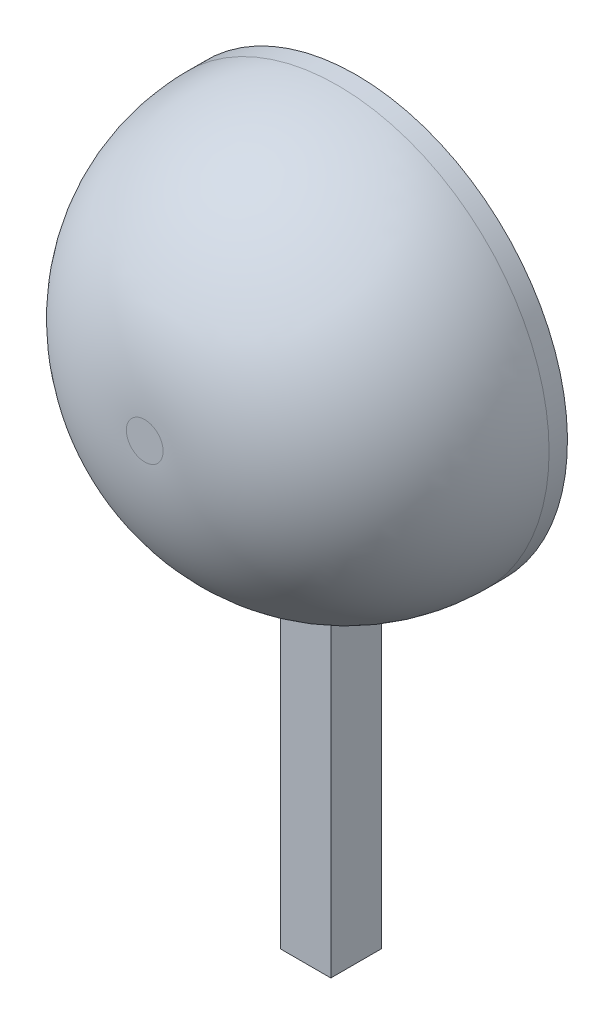
ISO-10303-21;
HEADER;
FILE_DESCRIPTION(('STEP AP214'),'2;1');
FILE_NAME('part.step','',(''),(''),'','','');
FILE_SCHEMA(('AUTOMOTIVE_DESIGN { 1 0 10303 214 1 1 1 1 }'));
ENDSEC;
DATA;
#1=APPLICATION_CONTEXT('core data for automotive mechanical design processes');
#2=APPLICATION_PROTOCOL_DEFINITION('international standard','automotive_design',2000,#1);
#3=PRODUCT_CONTEXT('',#1,'mechanical');
#4=PRODUCT('Part','Part','',(#3));
#5=PRODUCT_RELATED_PRODUCT_CATEGORY('part','',(#4));
#6=PRODUCT_DEFINITION_FORMATION('','',#4);
#7=PRODUCT_DEFINITION_CONTEXT('part definition',#1,'design');
#8=PRODUCT_DEFINITION('design','',#6,#7);
#9=PRODUCT_DEFINITION_SHAPE('','',#8);
#10=(LENGTH_UNIT() NAMED_UNIT(*) SI_UNIT(.MILLI.,.METRE.));
#11=(NAMED_UNIT(*) PLANE_ANGLE_UNIT() SI_UNIT($,.RADIAN.));
#12=(NAMED_UNIT(*) SI_UNIT($,.STERADIAN.) SOLID_ANGLE_UNIT());
#13=UNCERTAINTY_MEASURE_WITH_UNIT(LENGTH_MEASURE(1.E-05),#10,'distance_accuracy_value','');
#14=(GEOMETRIC_REPRESENTATION_CONTEXT(3) GLOBAL_UNCERTAINTY_ASSIGNED_CONTEXT((#13)) GLOBAL_UNIT_ASSIGNED_CONTEXT((#10,
#11,#12)) REPRESENTATION_CONTEXT('',''));
#15=CARTESIAN_POINT('',(0.,0.,0.));
#16=DIRECTION('',(0.,0.,1.));
#17=DIRECTION('',(1.,0.,0.));
#18=AXIS2_PLACEMENT_3D('',#15,#16,#17);
#19=CARTESIAN_POINT('',(0.,23.,23.));
#20=DIRECTION('',(0.,0.,-1.));
#21=DIRECTION('',(-1.,0.,0.));
#22=AXIS2_PLACEMENT_3D('',#19,#20,#21);
#23=CYLINDRICAL_SURFACE('',#22,23.);
#24=DIRECTION('',(0.,0.,-1.));
#25=VECTOR('',#24,1.);
#26=CARTESIAN_POINT('',(-2.75,0.164993978542503,23.));
#27=LINE('',#26,#25);
#28=CARTESIAN_POINT('',(-2.75,0.164993978542503,2.));
#29=VERTEX_POINT('',#28);
#30=CARTESIAN_POINT('',(-2.75,0.164993978542503,0.));
#31=VERTEX_POINT('',#30);
#32=EDGE_CURVE('E113',#29,#31,#27,.T.);
#33=ORIENTED_EDGE('',*,*,#32,.F.);
#34=CARTESIAN_POINT('',(0.,23.,2.));
#35=DIRECTION('',(0.,0.,1.));
#36=DIRECTION('',(1.,0.,0.));
#37=AXIS2_PLACEMENT_3D('',#34,#35,#36);
#38=CIRCLE('',#37,23.);
#39=CARTESIAN_POINT('',(2.75,0.164993978542503,2.));
#40=VERTEX_POINT('',#39);
#41=EDGE_CURVE('E127',#29,#40,#38,.F.);
#42=ORIENTED_EDGE('',*,*,#41,.T.);
#43=DIRECTION('',(0.,0.,-1.));
#44=VECTOR('',#43,1.);
#45=CARTESIAN_POINT('',(2.75,0.164993978542503,23.));
#46=LINE('',#45,#44);
#47=CARTESIAN_POINT('',(2.75,0.164993978542503,0.));
#48=VERTEX_POINT('',#47);
#49=EDGE_CURVE('E51',#48,#40,#46,.F.);
#50=ORIENTED_EDGE('',*,*,#49,.F.);
#51=CARTESIAN_POINT('',(0.,23.,0.));
#52=DIRECTION('',(0.,0.,1.));
#53=DIRECTION('',(1.,0.,0.));
#54=AXIS2_PLACEMENT_3D('',#51,#52,#53);
#55=CIRCLE('',#54,23.);
#56=EDGE_CURVE('E119',#48,#31,#55,.T.);
#57=ORIENTED_EDGE('',*,*,#56,.T.);
#58=EDGE_LOOP('',(#33,#42,#50,#57));
#59=FACE_BOUND('',#58,.T.);
#60=ADVANCED_FACE('F33',(#59),#23,.T.);
#61=CARTESIAN_POINT('',(0.,23.,2.));
#62=DIRECTION('',(0.,0.,1.));
#63=DIRECTION('',(1.,0.,0.));
#64=AXIS2_PLACEMENT_3D('',#61,#62,#63);
#65=DEGENERATE_TOROIDAL_SURFACE('',#64,2.,21.,.T.);
#66=CARTESIAN_POINT('',(0.,23.,23.));
#67=DIRECTION('',(0.,0.,1.));
#68=DIRECTION('',(1.,0.,0.));
#69=AXIS2_PLACEMENT_3D('',#66,#67,#68);
#70=CIRCLE('',#69,2.);
#71=CARTESIAN_POINT('',(2.,23.,23.));
#72=VERTEX_POINT('',#71);
#73=EDGE_CURVE('E124',#72,#72,#70,.T.);
#74=ORIENTED_EDGE('',*,*,#73,.F.);
#75=EDGE_LOOP('',(#74));
#76=FACE_BOUND('',#75,.T.);
#77=ORIENTED_EDGE('',*,*,#41,.F.);
#78=CARTESIAN_POINT('',(-2.75,0.244238915461579,3.81607804104343));
#79=CARTESIAN_POINT('',(-2.75,0.295303904716907,4.40007617175315));
#80=CARTESIAN_POINT('',(-2.75,0.371016300284282,4.98196435726745));
#81=CARTESIAN_POINT('',(-2.75,0.57120521786601,6.13732897865769));
#82=CARTESIAN_POINT('',(-2.75,0.695686814020979,6.71080453280703));
#83=CARTESIAN_POINT('',(-2.75,0.992555193617561,7.84534926697437));
#84=CARTESIAN_POINT('',(-2.75,1.16495162679832,8.40641592332233));
#85=CARTESIAN_POINT('',(-2.75,1.5564023105713,9.51201076491817));
#86=CARTESIAN_POINT('',(-2.75,1.77545530625545,10.0565393945346));
#87=CARTESIAN_POINT('',(-2.75,2.2585327522747,11.1249316469739));
#88=CARTESIAN_POINT('',(-2.75,2.52253402154036,11.6488057512484));
#89=CARTESIAN_POINT('',(-2.75,3.09370393761903,12.6724724277192));
#90=CARTESIAN_POINT('',(-2.75,3.40087290034709,13.1722648236419));
#91=CARTESIAN_POINT('',(-2.75,4.05643175349115,14.1445907349835));
#92=CARTESIAN_POINT('',(-2.75,4.40485254613023,14.6171034156274));
#93=CARTESIAN_POINT('',(-2.75,5.14023703734471,15.5311141664409));
#94=CARTESIAN_POINT('',(-2.75,5.5272005821954,15.9726123602974));
#95=CARTESIAN_POINT('',(-2.75,6.33742567468135,16.822026863039));
#96=CARTESIAN_POINT('',(-2.75,6.76073323458084,17.2298992820323));
#97=CARTESIAN_POINT('',(-2.75,7.64018950685398,18.0085640189915));
#98=CARTESIAN_POINT('',(-2.75,8.09633871399933,18.3793557781223));
#99=CARTESIAN_POINT('',(-2.75,9.03716404408144,19.0804956837766));
#100=CARTESIAN_POINT('',(-2.75,9.52177535815026,19.4109308106159));
#101=CARTESIAN_POINT('',(-2.75,10.5169438277042,20.0300310442123));
#102=CARTESIAN_POINT('',(-2.75,11.0274994033913,20.3186986901666));
#103=CARTESIAN_POINT('',(-2.75,12.0719691863424,20.8529243933765));
#104=CARTESIAN_POINT('',(-2.75,12.6059286872855,21.0983937910228));
#105=CARTESIAN_POINT('',(-2.75,13.6926077232238,21.5440764004659));
#106=CARTESIAN_POINT('',(-2.75,14.2453310192739,21.7442804768447));
#107=CARTESIAN_POINT('',(-2.75,15.0862669164747,22.010175908242));
#108=CARTESIAN_POINT('',(-2.75,15.3691164663192,22.0932005118105));
#109=CARTESIAN_POINT('',(-2.75,15.9380057408056,22.2475698902053));
#110=CARTESIAN_POINT('',(-2.75,16.2240454834208,22.3189145991925));
#111=CARTESIAN_POINT('',(-2.75,16.7985606702938,22.4498904912019));
#112=CARTESIAN_POINT('',(-2.75,17.0870341386364,22.5095303715771));
#113=CARTESIAN_POINT('',(-2.75,17.666125943743,22.6172944393123));
#114=CARTESIAN_POINT('',(-2.75,17.9567442786328,22.6654186367331));
#115=CARTESIAN_POINT('',(-2.75,18.4537104493097,22.7379162666053));
#116=CARTESIAN_POINT('',(-2.75,18.6596528964629,22.7651095412165));
#117=CARTESIAN_POINT('',(-2.75,19.0721786847007,22.8140979581512));
#118=CARTESIAN_POINT('',(-2.75,19.278762023405,22.8358931205008));
#119=CARTESIAN_POINT('',(-2.75,19.6924227432184,22.8743590640604));
#120=CARTESIAN_POINT('',(-2.75,19.8995001722479,22.891029326017));
#121=CARTESIAN_POINT('',(-2.75,20.3139740508323,22.9196501842365));
#122=CARTESIAN_POINT('',(-2.75,20.5213704953283,22.9316008545799));
#123=CARTESIAN_POINT('',(-2.75,20.9367876431798,22.9513898355892));
#124=CARTESIAN_POINT('',(-2.75,21.1448087471924,22.9592195317653));
#125=CARTESIAN_POINT('',(-2.75,21.5609483326243,22.9715169215669));
#126=CARTESIAN_POINT('',(-2.75,21.7690668152872,22.9759845710103));
#127=CARTESIAN_POINT('',(-2.75,22.1853625697365,22.9824505563655));
#128=CARTESIAN_POINT('',(-2.75,22.393539845524,22.9844486098226));
#129=CARTESIAN_POINT('',(-2.75,22.8099027138048,22.9866671576507));
#130=CARTESIAN_POINT('',(-2.75,23.0180883063022,22.9868876511322));
#131=CARTESIAN_POINT('',(-2.75,23.4343587271784,22.9856500310992));
#132=CARTESIAN_POINT('',(-2.75,23.6424435575414,22.9841926954817));
#133=CARTESIAN_POINT('',(-2.75,24.058587284974,22.9790389668758));
#134=CARTESIAN_POINT('',(-2.75,24.26664618216,22.9753425843263));
#135=CARTESIAN_POINT('',(-2.75,24.6826569741152,22.964835366272));
#136=CARTESIAN_POINT('',(-2.75,24.8906088806108,22.9580250239953));
#137=CARTESIAN_POINT('',(-2.75,25.306348294326,22.9404577753084));
#138=CARTESIAN_POINT('',(-2.75,25.5141358030221,22.9297009047572));
#139=CARTESIAN_POINT('',(-2.75,25.9289637460727,22.9036234131667));
#140=CARTESIAN_POINT('',(-2.75,26.1360048119144,22.8883130528973));
#141=CARTESIAN_POINT('',(-2.75,26.5496547141204,22.8526738434037));
#142=CARTESIAN_POINT('',(-2.75,26.7562635407797,22.8323448826917));
#143=CARTESIAN_POINT('',(-2.75,27.375200315473,22.763343181103));
#144=CARTESIAN_POINT('',(-2.75,27.7866811081787,22.706653095957));
#145=CARTESIAN_POINT('',(-2.75,28.491562162917,22.5895721272552));
#146=CARTESIAN_POINT('',(-2.75,28.7858804994783,22.5346254124817));
#147=CARTESIAN_POINT('',(-2.75,29.3720241318357,22.4127560316632));
#148=CARTESIAN_POINT('',(-2.75,29.66384954233,22.3458339197425));
#149=CARTESIAN_POINT('',(-2.75,30.2447530276149,22.1998612735266));
#150=CARTESIAN_POINT('',(-2.75,30.533828211701,22.1207992145477));
#151=CARTESIAN_POINT('',(-2.75,31.1083924592628,21.9506221906694));
#152=CARTESIAN_POINT('',(-2.75,31.3938814832588,21.8595070932063));
#153=CARTESIAN_POINT('',(-2.75,32.2424371323209,21.5687732961154));
#154=CARTESIAN_POINT('',(-2.75,32.7995062785294,21.3512859850417));
#155=CARTESIAN_POINT('',(-2.75,33.8929384944175,20.8699129402499));
#156=CARTESIAN_POINT('',(-2.75,34.4293078820668,20.6060415026676));
#157=CARTESIAN_POINT('',(-2.75,35.4785178648676,20.0330678237382));
#158=CARTESIAN_POINT('',(-2.75,35.9913174877255,19.7238904618136));
#159=CARTESIAN_POINT('',(-2.75,36.9886339679833,19.0627591718132));
#160=CARTESIAN_POINT('',(-2.75,37.4731477517375,18.7108006077306));
#161=CARTESIAN_POINT('',(-2.75,38.4111027489884,17.9659620049474));
#162=CARTESIAN_POINT('',(-2.75,38.8644845876722,17.5730071860934));
#163=CARTESIAN_POINT('',(-2.75,39.7357800953222,16.7495989771734));
#164=CARTESIAN_POINT('',(-2.75,40.1536952891682,16.319147200894));
#165=CARTESIAN_POINT('',(-2.75,40.9438171447543,15.4319151826649));
#166=CARTESIAN_POINT('',(-2.75,41.3167079398044,14.9757439442106));
#167=CARTESIAN_POINT('',(-2.75,42.022606130187,14.0335203491255));
#168=CARTESIAN_POINT('',(-2.75,42.3556137085734,13.5474681296563));
#169=CARTESIAN_POINT('',(-2.75,42.9790995130339,12.5493487160817));
#170=CARTESIAN_POINT('',(-2.75,43.2696112508071,12.037302454529));
#171=CARTESIAN_POINT('',(-2.75,43.8063323895786,10.9904951026733));
#172=CARTESIAN_POINT('',(-2.75,44.0525418674452,10.4557340517844));
#173=CARTESIAN_POINT('',(-2.75,44.4982843809741,9.36879364409215));
#174=CARTESIAN_POINT('',(-2.75,44.697942012253,8.81666537820112));
#175=CARTESIAN_POINT('',(-2.75,45.0500081016958,7.69754503286942));
#176=CARTESIAN_POINT('',(-2.75,45.2024166367236,7.13055297761044));
#177=CARTESIAN_POINT('',(-2.75,45.4589244409217,5.9856098777251));
#178=CARTESIAN_POINT('',(-2.75,45.5630127796844,5.4076563842806));
#179=CARTESIAN_POINT('',(-2.75,45.7220851193814,4.24503065478361));
#180=CARTESIAN_POINT('',(-2.75,45.7770691191746,3.66035841857498));
#181=CARTESIAN_POINT('',(-2.75,45.8375141120593,2.48895571201647));
#182=CARTESIAN_POINT('',(-2.75,45.843016933557,1.90222739962242));
#183=CARTESIAN_POINT('',(-2.75,45.804569623736,0.73039364195064));
#184=CARTESIAN_POINT('',(-2.75,45.7606195311418,0.145288195402461));
#185=CARTESIAN_POINT('',(-2.75,45.6235802127063,-1.01913882523905));
#186=CARTESIAN_POINT('',(-2.75,45.5304910441783,-1.5984604060776));
#187=CARTESIAN_POINT('',(-2.75,45.2958380444303,-2.74720172256494));
#188=CARTESIAN_POINT('',(-2.75,45.1542742012622,-3.31662145577307));
#189=CARTESIAN_POINT('',(-2.75,44.823675471886,-4.44153502110728));
#190=CARTESIAN_POINT('',(-2.75,44.6346386117991,-4.99702827312822));
#191=CARTESIAN_POINT('',(-2.75,44.2104463498235,-6.09011733540906));
#192=CARTESIAN_POINT('',(-2.75,43.9752909596228,-6.62771315020469));
#193=CARTESIAN_POINT('',(-2.75,43.4606084914156,-7.68105128637419));
#194=CARTESIAN_POINT('',(-2.75,43.1810931334128,-8.19679933450653));
#195=CARTESIAN_POINT('',(-2.75,42.5796409763504,-9.20293616399175));
#196=CARTESIAN_POINT('',(-2.75,42.2577041778452,-9.69332494567594));
#197=CARTESIAN_POINT('',(-2.75,41.5736920591004,-10.6452926467748));
#198=CARTESIAN_POINT('',(-2.75,41.2116150033944,-11.1068703191899));
#199=CARTESIAN_POINT('',(-2.75,40.4499193378752,-11.9979321057462));
#200=CARTESIAN_POINT('',(-2.75,40.0503007858099,-12.4274162692534));
#201=CARTESIAN_POINT('',(-2.75,39.2159576318368,-13.2516826964558));
#202=CARTESIAN_POINT('',(-2.75,38.7811983273259,-13.6464298327353));
#203=CARTESIAN_POINT('',(-2.75,37.8800283519079,-14.3979784060167));
#204=CARTESIAN_POINT('',(-2.75,37.4136173461614,-14.7547794414889));
#205=CARTESIAN_POINT('',(-2.75,36.4511720455254,-15.4288824097683));
#206=CARTESIAN_POINT('',(-2.75,35.9550601778782,-15.7460735793884));
#207=CARTESIAN_POINT('',(-2.75,34.937960509351,-16.3376425501258));
#208=CARTESIAN_POINT('',(-2.75,34.4169736765494,-16.6120220156087));
#209=CARTESIAN_POINT('',(-2.75,33.355674213288,-17.1153484862034));
#210=CARTESIAN_POINT('',(-2.75,32.8154325559677,-17.3444453459621));
#211=CARTESIAN_POINT('',(-2.75,31.7176745735725,-17.7570879501833));
#212=CARTESIAN_POINT('',(-2.75,31.1601557261194,-17.9406270078705));
#213=CARTESIAN_POINT('',(-2.75,30.2904745389701,-18.1879276052635));
#214=CARTESIAN_POINT('',(-2.75,29.9828636951393,-18.2680514798112));
#215=CARTESIAN_POINT('',(-2.75,29.3643994375061,-18.4147328074539));
#216=CARTESIAN_POINT('',(-2.75,29.0535459586416,-18.4812899877865));
#217=CARTESIAN_POINT('',(-2.75,28.4294306797419,-18.6009299609674));
#218=CARTESIAN_POINT('',(-2.75,28.1161701803651,-18.6540195669171));
#219=CARTESIAN_POINT('',(-2.75,27.4877257202485,-18.7471092881261));
#220=CARTESIAN_POINT('',(-2.75,27.1725418124474,-18.7871097620015));
#221=CARTESIAN_POINT('',(-2.75,26.5387941803255,-18.8549312134994));
#222=CARTESIAN_POINT('',(-2.75,26.2202218330817,-18.8826708236476));
#223=CARTESIAN_POINT('',(-2.75,25.5823164095609,-18.9269005959348));
#224=CARTESIAN_POINT('',(-2.75,25.2629833268811,-18.9433906630526));
#225=CARTESIAN_POINT('',(-2.75,24.6236443011213,-18.9674855215762));
#226=CARTESIAN_POINT('',(-2.75,24.3036380058469,-18.9750801850895));
#227=CARTESIAN_POINT('',(-2.75,23.8235669431839,-18.9821768183294));
#228=CARTESIAN_POINT('',(-2.75,23.6635251484852,-18.9838264446655));
#229=CARTESIAN_POINT('',(-2.75,23.343432878396,-18.9860125605766));
#230=CARTESIAN_POINT('',(-2.75,23.1833824029823,-18.9865490470198));
#231=CARTESIAN_POINT('',(-2.75,22.8263871989781,-18.9866612087013));
#232=CARTESIAN_POINT('',(-2.75,22.6294424106072,-18.9859868954891));
#233=CARTESIAN_POINT('',(-2.75,22.2355644394894,-18.9829171012162));
#234=CARTESIAN_POINT('',(-2.75,22.0386312567652,-18.9805216169118));
#235=CARTESIAN_POINT('',(-2.75,21.6448211718834,-18.9733480997565));
#236=CARTESIAN_POINT('',(-2.75,21.4479442664539,-18.9685702604205));
#237=CARTESIAN_POINT('',(-2.75,21.0542898298485,-18.9558815505779));
#238=CARTESIAN_POINT('',(-2.75,20.8575122977514,-18.9479707096674));
#239=CARTESIAN_POINT('',(-2.75,20.4643855714416,-18.9283808175842));
#240=CARTESIAN_POINT('',(-2.75,20.2680361489892,-18.916706471987));
#241=CARTESIAN_POINT('',(-2.75,19.8756362418927,-18.8891081052481));
#242=CARTESIAN_POINT('',(-2.75,19.6795857604277,-18.8731840392255));
#243=CARTESIAN_POINT('',(-2.75,19.0920748895156,-18.8184956928222));
#244=CARTESIAN_POINT('',(-2.75,18.7012255516479,-18.7728139122394));
#245=CARTESIAN_POINT('',(-2.75,17.9253365175882,-18.6618563212062));
#246=CARTESIAN_POINT('',(-2.75,17.5402752414264,-18.5967317135445));
#247=CARTESIAN_POINT('',(-2.75,16.7741108929234,-18.4461531041937));
#248=CARTESIAN_POINT('',(-2.75,16.3930080690628,-18.3606978342577));
#249=CARTESIAN_POINT('',(-2.75,15.6357181924521,-18.1691987260763));
#250=CARTESIAN_POINT('',(-2.75,15.2595347240592,-18.0631406809097));
#251=CARTESIAN_POINT('',(-2.75,14.5136036077637,-17.8305674066338));
#252=CARTESIAN_POINT('',(-2.75,14.143855386493,-17.7040540104994));
#253=CARTESIAN_POINT('',(-2.75,13.2260642386736,-17.3613855373752));
#254=CARTESIAN_POINT('',(-2.75,12.6827781626274,-17.1323236795677));
#255=CARTESIAN_POINT('',(-2.75,11.6176004918387,-16.6295982592706));
#256=CARTESIAN_POINT('',(-2.75,11.0956993926009,-16.3559547860574));
#257=CARTESIAN_POINT('',(-2.75,10.0747915609522,-15.7646270985598));
#258=CARTESIAN_POINT('',(-2.75,9.57587961869344,-15.4467790821384));
#259=CARTESIAN_POINT('',(-2.75,8.60666610119177,-14.7699852156885));
#260=CARTESIAN_POINT('',(-2.75,8.13636810006187,-14.4110342476409));
#261=CARTESIAN_POINT('',(-2.75,7.22830434253981,-13.6549553898003));
#262=CARTESIAN_POINT('',(-2.75,6.79050740797879,-13.2578649485288));
#263=CARTESIAN_POINT('',(-2.75,5.95012966082278,-12.4280444467577));
#264=CARTESIAN_POINT('',(-2.75,5.54754775070659,-11.9953154977943));
#265=CARTESIAN_POINT('',(-2.75,4.78096265660914,-11.0978365603956));
#266=CARTESIAN_POINT('',(-2.75,4.41691380750712,-10.633125576714));
#267=CARTESIAN_POINT('',(-2.75,3.72947518093469,-9.67454505086629));
#268=CARTESIAN_POINT('',(-2.75,3.40608530834711,-9.18067557691731));
#269=CARTESIAN_POINT('',(-2.75,2.80365377817384,-8.16958877190491));
#270=CARTESIAN_POINT('',(-2.75,2.5244201196347,-7.65248582512401));
#271=CARTESIAN_POINT('',(-2.75,2.01055792741936,-6.59655603060352));
#272=CARTESIAN_POINT('',(-2.75,1.77593035441015,-6.05772871529601));
#273=CARTESIAN_POINT('',(-2.75,1.35298755176571,-4.96225375860164));
#274=CARTESIAN_POINT('',(-2.75,1.16466841426558,-4.40560762538833));
#275=CARTESIAN_POINT('',(-2.75,0.835678449171734,-3.27844609420043));
#276=CARTESIAN_POINT('',(-2.75,0.695002678341973,-2.70793214166817));
#277=CARTESIAN_POINT('',(-2.75,0.479907341749479,-1.64426487257154));
#278=CARTESIAN_POINT('',(-2.75,0.398681534728542,-1.15247490662286));
#279=CARTESIAN_POINT('',(-2.75,0.271636017995831,-0.164190285061255));
#280=CARTESIAN_POINT('',(-2.75,0.225825943772959,0.332305613720139));
#281=CARTESIAN_POINT('',(-2.75,0.169893251700337,1.32728842983972));
#282=CARTESIAN_POINT('',(-2.75,0.159769553902756,1.82577528647011));
#283=CARTESIAN_POINT('',(-2.75,0.175250841605549,2.82204185960908));
#284=CARTESIAN_POINT('',(-2.75,0.20084610001908,3.31982173169725));
#285=CARTESIAN_POINT('',(-2.75,0.244238915461579,3.81607804104343));
#286=B_SPLINE_CURVE_WITH_KNOTS('',3,(#78,#79,#80,#81,#82,#83,#84,#85,#86,#87,#88,#89,#90,#91,
#92,#93,#94,#95,#96,#97,#98,#99,#100,#101,#102,#103,#104,#105,#106,#107,#108,#109,#110,#111,
#112,#113,#114,#115,#116,#117,#118,#119,#120,#121,#122,#123,#124,#125,#126,#127,#128,#129,#130,
#131,#132,#133,#134,#135,#136,#137,#138,#139,#140,#141,#142,#143,#144,#145,#146,#147,#148,#149,
#150,#151,#152,#153,#154,#155,#156,#157,#158,#159,#160,#161,#162,#163,#164,#165,#166,#167,#168,
#169,#170,#171,#172,#173,#174,#175,#176,#177,#178,#179,#180,#181,#182,#183,#184,#185,#186,#187,
#188,#189,#190,#191,#192,#193,#194,#195,#196,#197,#198,#199,#200,#201,#202,#203,#204,#205,#206,
#207,#208,#209,#210,#211,#212,#213,#214,#215,#216,#217,#218,#219,#220,#221,#222,#223,#224,#225,
#226,#227,#228,#229,#230,#231,#232,#233,#234,#235,#236,#237,#238,#239,#240,#241,#242,#243,#244,
#245,#246,#247,#248,#249,#250,#251,#252,#253,#254,#255,#256,#257,#258,#259,#260,#261,#262,#263,
#264,#265,#266,#267,#268,#269,#270,#271,#272,#273,#274,#275,#276,#277,#278,#279,#280,#281,#282,
#283,#284,#285),.UNSPECIFIED.,.T.,.F.,(4,2,2,2,2,2,2,2,2,2,2,2,2,2,2,2,2,2,2,2,2,2,2,2,2,2,2,2,
2,2,2,2,2,2,2,2,2,2,2,2,2,2,2,2,2,2,2,2,2,2,2,2,2,2,2,2,2,2,2,2,2,2,2,2,2,2,2,2,2,2,2,2,2,2,2,2,
2,2,2,2,2,2,2,2,2,2,2,2,2,2,2,2,2,2,2,2,2,2,2,2,2,2,2,4),(0.,1.75823639180851,3.51665576609099,
5.275429531624,7.03415599789991,8.79197817257485,10.5498132122265,12.3089734988028,
14.0681267693892,15.8295409652414,17.5909817030118,19.3485563928384,21.1060241883724,
22.8670579596931,24.6284468250966,25.5125914364808,26.3967410315776,27.2802311449889,
28.1637204865372,28.7868429056904,29.4099630131335,30.0331462341344,30.6563196730417,
31.2807906719766,31.9052698772294,32.5298204993156,33.1543714339018,33.7786329226311,
34.4028915009428,35.027051235577,35.6512052991089,36.2739634235661,36.8967353837911,
38.1421515716144,39.0401377747669,39.938082437128,40.8368848667183,41.7356971824746,
43.5274208799865,45.3185933122624,47.1127699693674,48.9071412269622,50.7048447536521,
52.5024709493241,54.2679281250638,56.0333771974882,57.7974264649203,59.5614726715425,
61.3207417892891,63.0800080450816,64.8396720670235,66.599336129861,68.3575125387636,
70.1156875709149,71.8738605524217,73.6320339672845,75.3902804972788,77.1485265816786,
78.9063089044706,80.6640912042979,82.4219495316085,84.1798051549434,85.9394184377402,
87.6990503381761,89.4634975567287,91.2278761627952,92.9863143446272,94.7450104699238,
95.6983736436705,96.6517559831765,97.604655050604,98.5575280083072,99.5166329565234,
100.475746005875,101.435949998438,101.916099013398,102.396249379163,102.987081481999,
103.577914698373,104.168699930089,104.759479581022,105.349523416251,105.939573483111,
107.119585041333,108.290648893487,109.461785816931,110.633733198791,111.805575622257,
113.572190219511,115.338010939238,117.110558558358,118.883327130406,120.65437250653,
122.425362666082,124.19422997437,125.963093144511,127.724039850796,129.485024477732,
131.245860448093,133.006513666961,134.500632546406,135.995157784926,137.489637795453,
138.98371090438),.UNSPECIFIED.);
#287=CARTESIAN_POINT('',(-2.75,0.460864768953649,5.5));
#288=VERTEX_POINT('',#287);
#289=EDGE_CURVE('E11',#29,#288,#286,.T.);
#290=ORIENTED_EDGE('',*,*,#289,.T.);
#291=CARTESIAN_POINT('',(0.,23.,5.5));
#292=DIRECTION('',(0.,0.,-1.));
#293=DIRECTION('',(-1.,0.,0.));
#294=AXIS2_PLACEMENT_3D('',#291,#292,#293);
#295=CIRCLE('',#294,22.7062792408487);
#296=CARTESIAN_POINT('',(2.75,0.460864768953653,5.5));
#297=VERTEX_POINT('',#296);
#298=EDGE_CURVE('E44',#288,#297,#295,.F.);
#299=ORIENTED_EDGE('',*,*,#298,.T.);
#300=CARTESIAN_POINT('',(2.75,0.244238915461577,3.81607804104343));
#301=CARTESIAN_POINT('',(2.75,0.193203787222342,3.23236602122092));
#302=CARTESIAN_POINT('',(2.75,0.166782403560234,2.64644029557156));
#303=CARTESIAN_POINT('',(2.75,0.163380631955268,1.47439464521947));
#304=CARTESIAN_POINT('',(2.75,0.186407278672547,0.888274704747552));
#305=CARTESIAN_POINT('',(2.75,0.281776354034549,-0.280337183705378));
#306=CARTESIAN_POINT('',(2.75,0.354151282917874,-0.862826485304052));
#307=CARTESIAN_POINT('',(2.75,0.547731938244975,-2.019610086644));
#308=CARTESIAN_POINT('',(2.75,0.668935940092208,-2.59390467507311));
#309=CARTESIAN_POINT('',(2.75,0.959293547369286,-3.73017930271548));
#310=CARTESIAN_POINT('',(2.75,1.12844222490606,-4.29216060113257));
#311=CARTESIAN_POINT('',(2.75,1.51348790795437,-5.39987774160766));
#312=CARTESIAN_POINT('',(2.75,1.7293852631243,-5.94561346212155));
#313=CARTESIAN_POINT('',(2.75,2.20626455094137,-7.01668590050284));
#314=CARTESIAN_POINT('',(2.75,2.46722358641825,-7.54203281328419));
#315=CARTESIAN_POINT('',(2.75,3.03243943842916,-8.56889409881543));
#316=CARTESIAN_POINT('',(2.75,3.33669626621043,-9.07040846537444));
#317=CARTESIAN_POINT('',(2.75,3.98629440925626,-10.0459891763443));
#318=CARTESIAN_POINT('',(2.75,4.33163040925408,-10.5200590600432));
#319=CARTESIAN_POINT('',(2.75,5.06095056409169,-11.4374662488847));
#320=CARTESIAN_POINT('',(2.75,5.44493435741559,-11.8808038414353));
#321=CARTESIAN_POINT('',(2.75,6.24933370742976,-12.7341807254416));
#322=CARTESIAN_POINT('',(2.75,6.6697957860582,-13.1441761649837));
#323=CARTESIAN_POINT('',(2.75,7.5437298183881,-13.9273609366386));
#324=CARTESIAN_POINT('',(2.75,7.99720295735081,-14.3005489460476));
#325=CARTESIAN_POINT('',(2.75,8.93515188561003,-15.0084478393296));
#326=CARTESIAN_POINT('',(2.75,9.41970722310389,-15.3430533233555));
#327=CARTESIAN_POINT('',(2.75,10.4151847123371,-15.9702937046365));
#328=CARTESIAN_POINT('',(2.75,10.9261040713795,-16.2629330349366));
#329=CARTESIAN_POINT('',(2.75,11.9686270001979,-16.8032705802762));
#330=CARTESIAN_POINT('',(2.75,12.500141310142,-17.0511410318387));
#331=CARTESIAN_POINT('',(2.75,13.5820656374724,-17.5019035303231));
#332=CARTESIAN_POINT('',(2.75,14.1324811264647,-17.7047824239256));
#333=CARTESIAN_POINT('',(2.75,15.2502654010346,-18.0651473199115));
#334=CARTESIAN_POINT('',(2.75,15.8176889966429,-18.2224639799541));
#335=CARTESIAN_POINT('',(2.75,16.6765893945617,-18.4234439770919));
#336=CARTESIAN_POINT('',(2.75,16.9640922195331,-18.4845911005333));
#337=CARTESIAN_POINT('',(2.75,17.5413249885431,-18.5954023516683));
#338=CARTESIAN_POINT('',(2.75,17.8310549814406,-18.6450662266985));
#339=CARTESIAN_POINT('',(2.75,18.4142676038446,-18.7334707013633));
#340=CARTESIAN_POINT('',(2.75,18.7077622758141,-18.7721313730469));
#341=CARTESIAN_POINT('',(2.75,19.2959521281319,-18.8385749806829));
#342=CARTESIAN_POINT('',(2.75,19.590647228142,-18.8663586328734));
#343=CARTESIAN_POINT('',(2.75,20.1811746488174,-18.9120107045085));
#344=CARTESIAN_POINT('',(2.75,20.4770079455045,-18.9298663026991));
#345=CARTESIAN_POINT('',(2.75,20.9210412902428,-18.9504038261755));
#346=CARTESIAN_POINT('',(2.75,21.0691083089397,-18.9562088452304));
#347=CARTESIAN_POINT('',(2.75,21.3653024089355,-18.9660259133733));
#348=CARTESIAN_POINT('',(2.75,21.5134294903456,-18.9700379591256));
#349=CARTESIAN_POINT('',(2.75,21.8841391175021,-18.9782276413302));
#350=CARTESIAN_POINT('',(2.75,22.1067414882269,-18.9814758865189));
#351=CARTESIAN_POINT('',(2.75,22.5519692877966,-18.9856594972594));
#352=CARTESIAN_POINT('',(2.75,22.7745947170465,-18.986594810973));
#353=CARTESIAN_POINT('',(2.75,23.2198680209273,-18.9866108291199));
#354=CARTESIAN_POINT('',(2.75,23.4425158955857,-18.9856913488583));
#355=CARTESIAN_POINT('',(2.75,23.8877908653361,-18.9815465534227));
#356=CARTESIAN_POINT('',(2.75,24.1104179606019,-18.9783212596784));
#357=CARTESIAN_POINT('',(2.75,24.5554300385411,-18.9685425865089));
#358=CARTESIAN_POINT('',(2.75,24.7778150741632,-18.9619918191678));
#359=CARTESIAN_POINT('',(2.75,25.2224163019039,-18.9445126843658));
#360=CARTESIAN_POINT('',(2.75,25.4446324959095,-18.9335843665728));
#361=CARTESIAN_POINT('',(2.75,25.8886969923751,-18.9065329237248));
#362=CARTESIAN_POINT('',(2.75,26.1105453765249,-18.8904111719778));
#363=CARTESIAN_POINT('',(2.75,26.5537489347678,-18.8524121730905));
#364=CARTESIAN_POINT('',(2.75,26.775104100512,-18.8305348292564));
#365=CARTESIAN_POINT('',(2.75,27.4350479797612,-18.7560255657861));
#366=CARTESIAN_POINT('',(2.75,27.8726612355752,-18.6943368438342));
#367=CARTESIAN_POINT('',(2.75,28.7435813788202,-18.5451623523343));
#368=CARTESIAN_POINT('',(2.75,29.1768871883495,-18.4576702857426));
#369=CARTESIAN_POINT('',(2.75,30.0372422420726,-18.2564689298938));
#370=CARTESIAN_POINT('',(2.75,30.464293339676,-18.1427675813197));
#371=CARTESIAN_POINT('',(2.75,31.3104766118515,-17.8891613600377));
#372=CARTESIAN_POINT('',(2.75,31.7296103441947,-17.7492617023265));
#373=CARTESIAN_POINT('',(2.75,32.4202932357373,-17.4944866957243));
#374=CARTESIAN_POINT('',(2.75,32.6945116422568,-17.3867911163829));
#375=CARTESIAN_POINT('',(2.75,33.2381799440605,-17.160043030643));
#376=CARTESIAN_POINT('',(2.75,33.5076301826974,-17.0409913459684));
#377=CARTESIAN_POINT('',(2.75,34.3080487031918,-16.6670759182761));
#378=CARTESIAN_POINT('',(2.75,34.8312673057625,-16.3953845029986));
#379=CARTESIAN_POINT('',(2.75,35.8544554589443,-15.8081116051898));
#380=CARTESIAN_POINT('',(2.75,36.3543545152564,-15.4924072675454));
#381=CARTESIAN_POINT('',(2.75,37.0827200078735,-14.9881224427202));
#382=CARTESIAN_POINT('',(2.75,37.3219382538562,-14.8148976426293));
#383=CARTESIAN_POINT('',(2.75,37.7928933916681,-14.4584364059766));
#384=CARTESIAN_POINT('',(2.75,38.0246283215846,-14.2751973773302));
#385=CARTESIAN_POINT('',(2.75,38.7074975554534,-13.7113036177529));
#386=CARTESIAN_POINT('',(2.75,39.1467786508334,-13.3161381906945));
#387=CARTESIAN_POINT('',(2.75,39.9902977887742,-12.4900267384092));
#388=CARTESIAN_POINT('',(2.75,40.3945359427895,-12.059080826991));
#389=CARTESIAN_POINT('',(2.75,40.972202907519,-11.3884239123927));
#390=CARTESIAN_POINT('',(2.75,41.1599295281579,-11.1608973329758));
#391=CARTESIAN_POINT('',(2.75,41.5255293781175,-10.6981582777417));
#392=CARTESIAN_POINT('',(2.75,41.7034051317009,-10.4629477956989));
#393=CARTESIAN_POINT('',(2.75,42.2218614996264,-9.74628302643049));
#394=CARTESIAN_POINT('',(2.75,42.5473124323737,-9.25374756045936));
#395=CARTESIAN_POINT('',(2.75,43.1539032324028,-8.2452404916488));
#396=CARTESIAN_POINT('',(2.75,43.4352374007306,-7.72938533074259));
#397=CARTESIAN_POINT('',(2.75,43.9534110206296,-6.67576836054943));
#398=CARTESIAN_POINT('',(2.75,44.1902504712512,-6.13800655079493));
#399=CARTESIAN_POINT('',(2.75,44.6177697846851,-5.04430445738681));
#400=CARTESIAN_POINT('',(2.75,44.8084393287013,-4.48836014146851));
#401=CARTESIAN_POINT('',(2.75,45.1421891666546,-3.36236461107942));
#402=CARTESIAN_POINT('',(2.75,45.2852695094783,-2.79231341110076));
#403=CARTESIAN_POINT('',(2.75,45.5226418172879,-1.64301078120672));
#404=CARTESIAN_POINT('',(2.75,45.6170046862567,-1.06377399379359));
#405=CARTESIAN_POINT('',(2.75,45.7565839693513,0.100590857001035));
#406=CARTESIAN_POINT('',(2.75,45.8018004317221,0.685718914598756));
#407=CARTESIAN_POINT('',(2.75,45.8427645733995,1.85771992751148));
#408=CARTESIAN_POINT('',(2.75,45.838510911221,2.44459292971286));
#409=CARTESIAN_POINT('',(2.75,45.7805619746852,3.61589302306114));
#410=CARTESIAN_POINT('',(2.75,45.7268666882493,4.20032011361048));
#411=CARTESIAN_POINT('',(2.75,45.5704312712849,5.3624713406721));
#412=CARTESIAN_POINT('',(2.75,45.4676995098461,5.94019660376211));
#413=CARTESIAN_POINT('',(2.75,45.2139280551045,7.08493751169675));
#414=CARTESIAN_POINT('',(2.75,45.0628883921959,7.65195316327936));
#415=CARTESIAN_POINT('',(2.75,44.7136367291117,8.77106038075461));
#416=CARTESIAN_POINT('',(2.75,44.5154402997327,9.32315680599303));
#417=CARTESIAN_POINT('',(2.75,44.0732638688961,10.4086991368712));
#418=CARTESIAN_POINT('',(2.75,43.8292838492427,10.9421450350986));
#419=CARTESIAN_POINT('',(2.75,43.297332199789,11.9864966490091));
#420=CARTESIAN_POINT('',(2.75,43.0093698183197,12.4974070742682));
#421=CARTESIAN_POINT('',(2.75,42.3914891063135,13.4931675059787));
#422=CARTESIAN_POINT('',(2.75,42.0615708881153,13.978017582203));
#423=CARTESIAN_POINT('',(2.75,41.3616870955611,14.9188062335012));
#424=CARTESIAN_POINT('',(2.75,40.9916788183675,15.3747131431323));
#425=CARTESIAN_POINT('',(2.75,40.4090025282169,16.0338725093578));
#426=CARTESIAN_POINT('',(2.75,40.2101552245281,16.2494861955906));
#427=CARTESIAN_POINT('',(2.75,39.803508849726,16.6722082260223));
#428=CARTESIAN_POINT('',(2.75,39.5957075109902,16.8793143894297));
#429=CARTESIAN_POINT('',(2.75,38.9588219498374,17.487868818834));
#430=CARTESIAN_POINT('',(2.75,38.5168088666563,17.8759278946053));
#431=CARTESIAN_POINT('',(2.75,37.601674346685,18.6134450678607));
#432=CARTESIAN_POINT('',(2.75,37.1285528168902,18.9629030499311));
#433=CARTESIAN_POINT('',(2.75,36.3988877137162,19.4558191173457));
#434=CARTESIAN_POINT('',(2.75,36.1526637002604,19.6147290140137));
#435=CARTESIAN_POINT('',(2.75,35.6538408760648,19.9220551875738));
#436=CARTESIAN_POINT('',(2.75,35.4012437142632,20.0704741417852));
#437=CARTESIAN_POINT('',(2.75,34.6343869831701,20.4997127755878));
#438=CARTESIAN_POINT('',(2.75,34.1110450406252,20.7645257913008));
#439=CARTESIAN_POINT('',(2.75,33.0429273415482,21.2501775395598));
#440=CARTESIAN_POINT('',(2.75,32.4981030080846,21.4709088491868));
#441=CARTESIAN_POINT('',(2.75,31.3920051467685,21.8664236806011));
#442=CARTESIAN_POINT('',(2.75,30.8307333524622,22.0412120255098));
#443=CARTESIAN_POINT('',(2.75,29.9783320104843,22.2688789405882));
#444=CARTESIAN_POINT('',(2.75,29.6917280527316,22.3391458602483));
#445=CARTESIAN_POINT('',(2.75,29.1158809114865,22.4680107697815));
#446=CARTESIAN_POINT('',(2.75,28.8266376435679,22.5266083849992));
#447=CARTESIAN_POINT('',(2.75,28.2461075900496,22.6322566272908));
#448=CARTESIAN_POINT('',(2.75,27.9548211342221,22.6793090755755));
#449=CARTESIAN_POINT('',(2.75,27.3706824907225,22.7621881210856));
#450=CARTESIAN_POINT('',(2.75,27.0778304413726,22.7980156939019));
#451=CARTESIAN_POINT('',(2.75,26.581684547443,22.8496256520982));
#452=CARTESIAN_POINT('',(2.75,26.3786725804312,22.8681812955173));
#453=CARTESIAN_POINT('',(2.75,25.9722707412914,22.9005531307034));
#454=CARTESIAN_POINT('',(2.75,25.7688808674176,22.9143693005226));
#455=CARTESIAN_POINT('',(2.75,25.3618135958194,22.9377338711288));
#456=CARTESIAN_POINT('',(2.75,25.1581361424862,22.9472812843575));
#457=CARTESIAN_POINT('',(2.75,24.7506474773433,22.9627570321931));
#458=CARTESIAN_POINT('',(2.75,24.5468362651533,22.9686853564652));
#459=CARTESIAN_POINT('',(2.75,24.1388530971282,22.9777405461274));
#460=CARTESIAN_POINT('',(2.75,23.9346810546228,22.9808632430743));
#461=CARTESIAN_POINT('',(2.75,23.5263172782054,22.9850920054709));
#462=CARTESIAN_POINT('',(2.75,23.3221255442005,22.9861980608968));
#463=CARTESIAN_POINT('',(2.75,22.9137419070538,22.9868267133369));
#464=CARTESIAN_POINT('',(2.75,22.7095500039319,22.9863493253673));
#465=CARTESIAN_POINT('',(2.75,22.3011771572031,22.9836093006381));
#466=CARTESIAN_POINT('',(2.75,22.0969962135745,22.9813466675574));
#467=CARTESIAN_POINT('',(2.75,21.6891309294402,22.9743388552826));
#468=CARTESIAN_POINT('',(2.75,21.4854465009016,22.9695992475092));
#469=CARTESIAN_POINT('',(2.75,21.0781796714442,22.9568059972143));
#470=CARTESIAN_POINT('',(2.75,20.8745972695796,22.9487523860084));
#471=CARTESIAN_POINT('',(2.75,20.4676583285077,22.9286101080987));
#472=CARTESIAN_POINT('',(2.75,20.2643017590434,22.916522070484));
#473=CARTESIAN_POINT('',(2.75,19.8579117260556,22.8877788520752));
#474=CARTESIAN_POINT('',(2.75,19.6548782655878,22.8711236283445));
#475=CARTESIAN_POINT('',(2.75,19.0473478854214,22.8137958639051));
#476=CARTESIAN_POINT('',(2.75,18.6435146210706,22.7657202106974));
#477=CARTESIAN_POINT('',(2.75,17.8389420131611,22.6481162446704));
#478=CARTESIAN_POINT('',(2.75,17.4382028478327,22.5785867053471));
#479=CARTESIAN_POINT('',(2.75,16.7478134383073,22.4390074948178));
#480=CARTESIAN_POINT('',(2.75,16.4571230805232,22.374072517106));
#481=CARTESIAN_POINT('',(2.75,15.8787028776711,22.2322909029822));
#482=CARTESIAN_POINT('',(2.75,15.5909727658377,22.1554453501088));
#483=CARTESIAN_POINT('',(2.75,14.732379040541,21.9068423679609));
#484=CARTESIAN_POINT('',(2.75,14.1665967198091,21.7171161241266));
#485=CARTESIAN_POINT('',(2.75,13.0539960068421,21.2909574928737));
#486=CARTESIAN_POINT('',(2.75,12.5071492022241,21.0545989942681));
#487=CARTESIAN_POINT('',(2.75,11.4356285225508,20.5364868788243));
#488=CARTESIAN_POINT('',(2.75,10.9109462742068,20.2547506018566));
#489=CARTESIAN_POINT('',(2.75,9.88693547730007,19.6474153739006));
#490=CARTESIAN_POINT('',(2.75,9.38763167660199,19.3217746980426));
#491=CARTESIAN_POINT('',(2.75,8.41852739746627,18.62906780762));
#492=CARTESIAN_POINT('',(2.75,7.9487310761443,18.2619957763473));
#493=CARTESIAN_POINT('',(2.75,7.04162149105681,17.4886064789606));
#494=CARTESIAN_POINT('',(2.75,6.60434942182096,17.0822408931082));
#495=CARTESIAN_POINT('',(2.75,5.76619290590405,16.2336171159196));
#496=CARTESIAN_POINT('',(2.75,5.36530625484541,15.7913611020513));
#497=CARTESIAN_POINT('',(2.75,4.60792975486349,14.880266527845));
#498=CARTESIAN_POINT('',(2.75,4.25092039574613,14.4118596841645));
#499=CARTESIAN_POINT('',(2.75,3.57773703241536,13.4465346460269));
#500=CARTESIAN_POINT('',(2.75,3.26156461861178,12.9496153422294));
#501=CARTESIAN_POINT('',(2.75,2.67268179867832,11.9314133524884));
#502=CARTESIAN_POINT('',(2.75,2.39992307512711,11.4101585986662));
#503=CARTESIAN_POINT('',(2.75,1.89942245365872,10.3465239531202));
#504=CARTESIAN_POINT('',(2.75,1.67167396152843,9.80414716983221));
#505=CARTESIAN_POINT('',(2.75,1.30523153980203,8.81652154705702));
#506=CARTESIAN_POINT('',(2.75,1.1578645498677,8.37446586317571));
#507=CARTESIAN_POINT('',(2.75,0.893021043026815,7.48136587329826));
#508=CARTESIAN_POINT('',(2.75,0.775550946568449,7.03031965894688));
#509=CARTESIAN_POINT('',(2.75,0.571070989106869,6.12131479029689));
#510=CARTESIAN_POINT('',(2.75,0.484064985208003,5.66335526834539));
#511=CARTESIAN_POINT('',(2.75,0.34093817401369,4.74275550555105));
#512=CARTESIAN_POINT('',(2.75,0.284810722984985,4.28011629340805));
#513=CARTESIAN_POINT('',(2.75,0.244238915461577,3.81607804104343));
#514=B_SPLINE_CURVE_WITH_KNOTS('',3,(#300,#301,#302,#303,#304,#305,#306,#307,#308,#309,#310,
#311,#312,#313,#314,#315,#316,#317,#318,#319,#320,#321,#322,#323,#324,#325,#326,#327,#328,#329,
#330,#331,#332,#333,#334,#335,#336,#337,#338,#339,#340,#341,#342,#343,#344,#345,#346,#347,#348,
#349,#350,#351,#352,#353,#354,#355,#356,#357,#358,#359,#360,#361,#362,#363,#364,#365,#366,#367,
#368,#369,#370,#371,#372,#373,#374,#375,#376,#377,#378,#379,#380,#381,#382,#383,#384,#385,#386,
#387,#388,#389,#390,#391,#392,#393,#394,#395,#396,#397,#398,#399,#400,#401,#402,#403,#404,#405,
#406,#407,#408,#409,#410,#411,#412,#413,#414,#415,#416,#417,#418,#419,#420,#421,#422,#423,#424,
#425,#426,#427,#428,#429,#430,#431,#432,#433,#434,#435,#436,#437,#438,#439,#440,#441,#442,#443,
#444,#445,#446,#447,#448,#449,#450,#451,#452,#453,#454,#455,#456,#457,#458,#459,#460,#461,#462,
#463,#464,#465,#466,#467,#468,#469,#470,#471,#472,#473,#474,#475,#476,#477,#478,#479,#480,#481,
#482,#483,#484,#485,#486,#487,#488,#489,#490,#491,#492,#493,#494,#495,#496,#497,#498,#499,#500,
#501,#502,#503,#504,#505,#506,#507,#508,#509,#510,#511,#512,#513),.UNSPECIFIED.,.T.,.F.,(4,2,2,
2,2,2,2,2,2,2,2,2,2,2,2,2,2,2,2,2,2,2,2,2,2,2,2,2,2,2,2,2,2,2,2,2,2,2,2,2,2,2,2,2,2,2,2,2,2,2,2,
2,2,2,2,2,2,2,2,2,2,2,2,2,2,2,2,2,2,2,2,2,2,2,2,2,2,2,2,2,2,2,2,2,2,2,2,2,2,2,2,2,2,2,2,2,2,2,2,
2,2,2,2,2,2,2,4),(0.,1.75740250005594,3.51505503127025,5.27386625272641,7.03261536008369,
8.79118376360713,10.5497653208597,12.3074559063723,14.0651469484715,15.8226108084079,
17.580058230353,19.3397808898512,21.0995667633375,22.8640515043498,24.6283497185937,
26.3857085422564,28.1435804559184,29.907904429714,30.7895130511135,31.6711410685184,
32.5590187230626,33.4468379021426,34.3358009784015,34.7803345317256,35.2248689120857,
35.8927282314198,36.5606025188928,37.2285433146145,37.8964779027557,38.563888653348,
39.2312918316764,39.898518672202,40.5657567228495,41.8907914541626,43.2161498146723,
44.5411071550412,45.8658010311764,46.7493809585035,47.6328969987204,49.3993473583546,
51.1708310683464,52.0566525142773,52.9427043424434,54.7130536298574,56.4833972864541,
57.3680863509668,58.2525476568529,60.0212814183592,61.781992105062,63.5427028293443,
65.3038067032349,67.064908768003,68.8234404268801,70.5819703594812,72.3405479783827,
74.0991260269054,75.8574040449365,77.6156809567072,79.3733781028886,81.1310759476385,
82.8884047024099,84.6457287519442,86.4049434075841,87.284643622537,88.1645679475348,
89.9269117114905,91.6892607445467,92.5681862592183,93.4468866535626,95.2042256388682,
96.965796193004,98.7271817424272,99.6122591619341,100.497364993208,101.382331112164,
102.267220294443,102.878741101375,103.490264740117,104.101929779066,104.713596564704,
105.32617063482,105.938747749733,106.551319055378,107.163889098683,107.775087190445,
108.386279506844,108.997376564361,109.608479367069,110.827965923439,112.047522209936,
112.940837971174,113.834072512603,115.622020184017,117.407157280817,119.191613847897,
120.977778400167,122.764194031628,124.552835073752,126.341367680245,128.106115689136,
129.870932406076,131.633771018336,133.396351174584,134.793271811309,136.190492188307,
137.587889405552,138.984985845463),.UNSPECIFIED.);
#515=EDGE_CURVE('E136',#297,#40,#514,.T.);
#516=ORIENTED_EDGE('',*,*,#515,.T.);
#517=EDGE_LOOP('',(#77,#290,#299,#516));
#518=FACE_BOUND('',#517,.T.);
#519=ADVANCED_FACE('F140',(#76,#518),#65,.T.);
#520=CARTESIAN_POINT('',(0.,23.,1.));
#521=DIRECTION('',(0.,0.,1.));
#522=DIRECTION('',(1.,0.,0.));
#523=AXIS2_PLACEMENT_3D('',#520,#521,#522);
#524=TOROIDAL_SURFACE('',#523,21.,1.);
#525=CARTESIAN_POINT('',(0.,23.,1.));
#526=DIRECTION('',(0.,0.,1.));
#527=DIRECTION('',(1.,0.,0.));
#528=AXIS2_PLACEMENT_3D('',#525,#526,#527);
#529=CIRCLE('',#528,20.);
#530=CARTESIAN_POINT('',(20.,23.,1.));
#531=VERTEX_POINT('',#530);
#532=EDGE_CURVE('E130',#531,#531,#529,.F.);
#533=ORIENTED_EDGE('',*,*,#532,.F.);
#534=EDGE_LOOP('',(#533));
#535=FACE_BOUND('',#534,.T.);
#536=CARTESIAN_POINT('',(0.,23.,0.));
#537=DIRECTION('',(0.,0.,1.));
#538=DIRECTION('',(1.,0.,0.));
#539=AXIS2_PLACEMENT_3D('',#536,#537,#538);
#540=CIRCLE('',#539,21.);
#541=CARTESIAN_POINT('',(21.,23.,0.));
#542=VERTEX_POINT('',#541);
#543=EDGE_CURVE('E133',#542,#542,#540,.T.);
#544=ORIENTED_EDGE('',*,*,#543,.F.);
#545=EDGE_LOOP('',(#544));
#546=FACE_BOUND('',#545,.T.);
#547=ADVANCED_FACE('F35',(#535,#546),#524,.T.);
#548=CARTESIAN_POINT('',(0.,23.,23.));
#549=DIRECTION('',(0.,0.,1.));
#550=DIRECTION('',(1.,0.,0.));
#551=AXIS2_PLACEMENT_3D('',#548,#549,#550);
#552=PLANE('',#551);
#553=ORIENTED_EDGE('',*,*,#73,.T.);
#554=EDGE_LOOP('',(#553));
#555=FACE_BOUND('',#554,.T.);
#556=ADVANCED_FACE('F165',(#555),#552,.T.);
#557=CARTESIAN_POINT('',(0.,23.,0.));
#558=DIRECTION('',(0.,0.,1.));
#559=DIRECTION('',(1.,0.,0.));
#560=AXIS2_PLACEMENT_3D('',#557,#558,#559);
#561=PLANE('',#560);
#562=ORIENTED_EDGE('',*,*,#56,.F.);
#563=DIRECTION('',(0.,-1.,0.));
#564=VECTOR('',#563,1.);
#565=CARTESIAN_POINT('',(2.75,2.,0.));
#566=LINE('',#565,#564);
#567=CARTESIAN_POINT('',(2.75,-35.,0.));
#568=VERTEX_POINT('',#567);
#569=EDGE_CURVE('E109',#48,#568,#566,.T.);
#570=ORIENTED_EDGE('',*,*,#569,.T.);
#571=DIRECTION('',(-1.,0.,0.));
#572=VECTOR('',#571,1.);
#573=CARTESIAN_POINT('',(-2.75,-35.,0.));
#574=LINE('',#573,#572);
#575=CARTESIAN_POINT('',(-2.75,-35.,0.));
#576=VERTEX_POINT('',#575);
#577=EDGE_CURVE('E106',#568,#576,#574,.T.);
#578=ORIENTED_EDGE('',*,*,#577,.T.);
#579=DIRECTION('',(0.,-1.,0.));
#580=VECTOR('',#579,1.);
#581=CARTESIAN_POINT('',(-2.75,2.,0.));
#582=LINE('',#581,#580);
#583=EDGE_CURVE('E102',#31,#576,#582,.T.);
#584=ORIENTED_EDGE('',*,*,#583,.F.);
#585=EDGE_LOOP('',(#562,#570,#578,#584));
#586=FACE_BOUND('',#585,.T.);
#587=ORIENTED_EDGE('',*,*,#543,.T.);
#588=EDGE_LOOP('',(#587));
#589=FACE_BOUND('',#588,.T.);
#590=ADVANCED_FACE('F157',(#586,#589),#561,.F.);
#591=CARTESIAN_POINT('',(0.,23.,23.));
#592=DIRECTION('',(0.,0.,-1.));
#593=DIRECTION('',(-1.,0.,0.));
#594=AXIS2_PLACEMENT_3D('',#591,#592,#593);
#595=CYLINDRICAL_SURFACE('',#594,20.);
#596=ORIENTED_EDGE('',*,*,#532,.T.);
#597=EDGE_LOOP('',(#596));
#598=FACE_BOUND('',#597,.T.);
#599=CARTESIAN_POINT('',(0.,23.,2.));
#600=DIRECTION('',(0.,0.,-1.));
#601=DIRECTION('',(-1.,0.,0.));
#602=AXIS2_PLACEMENT_3D('',#599,#600,#601);
#603=CIRCLE('',#602,20.);
#604=CARTESIAN_POINT('',(-20.,23.,2.));
#605=VERTEX_POINT('',#604);
#606=EDGE_CURVE('E116',#605,#605,#603,.T.);
#607=ORIENTED_EDGE('',*,*,#606,.F.);
#608=EDGE_LOOP('',(#607));
#609=FACE_BOUND('',#608,.T.);
#610=ADVANCED_FACE('F153',(#598,#609),#595,.F.);
#611=CARTESIAN_POINT('',(0.,23.,20.));
#612=DIRECTION('',(0.,0.,1.));
#613=DIRECTION('',(1.,0.,0.));
#614=AXIS2_PLACEMENT_3D('',#611,#612,#613);
#615=PLANE('',#614);
#616=CARTESIAN_POINT('',(0.,23.,20.));
#617=DIRECTION('',(0.,0.,1.));
#618=DIRECTION('',(1.,0.,0.));
#619=AXIS2_PLACEMENT_3D('',#616,#617,#618);
#620=CIRCLE('',#619,2.);
#621=CARTESIAN_POINT('',(2.,23.,20.));
#622=VERTEX_POINT('',#621);
#623=EDGE_CURVE('E115',#622,#622,#620,.T.);
#624=ORIENTED_EDGE('',*,*,#623,.F.);
#625=EDGE_LOOP('',(#624));
#626=FACE_BOUND('',#625,.T.);
#627=ADVANCED_FACE('F156',(#626),#615,.F.);
#628=CARTESIAN_POINT('',(0.,23.,2.));
#629=DIRECTION('',(0.,0.,1.));
#630=DIRECTION('',(1.,0.,0.));
#631=AXIS2_PLACEMENT_3D('',#628,#629,#630);
#632=DEGENERATE_TOROIDAL_SURFACE('',#631,2.,18.,.T.);
#633=ORIENTED_EDGE('',*,*,#606,.T.);
#634=EDGE_LOOP('',(#633));
#635=FACE_BOUND('',#634,.T.);
#636=ORIENTED_EDGE('',*,*,#623,.T.);
#637=EDGE_LOOP('',(#636));
#638=FACE_BOUND('',#637,.T.);
#639=ADVANCED_FACE('F152',(#635,#638),#632,.F.);
#640=CARTESIAN_POINT('',(-2.75,2.,0.));
#641=DIRECTION('',(1.,0.,0.));
#642=DIRECTION('',(0.,0.,-1.));
#643=AXIS2_PLACEMENT_3D('',#640,#641,#642);
#644=PLANE('',#643);
#645=ORIENTED_EDGE('',*,*,#289,.F.);
#646=ORIENTED_EDGE('',*,*,#32,.T.);
#647=ORIENTED_EDGE('',*,*,#583,.T.);
#648=DIRECTION('',(0.,0.,1.));
#649=VECTOR('',#648,1.);
#650=CARTESIAN_POINT('',(-2.75,-35.,0.));
#651=LINE('',#650,#649);
#652=CARTESIAN_POINT('',(-2.75,-35.,5.5));
#653=VERTEX_POINT('',#652);
#654=EDGE_CURVE('E95',#576,#653,#651,.T.);
#655=ORIENTED_EDGE('',*,*,#654,.T.);
#656=DIRECTION('',(0.,-1.,0.));
#657=VECTOR('',#656,1.);
#658=CARTESIAN_POINT('',(-2.75,2.,5.5));
#659=LINE('',#658,#657);
#660=EDGE_CURVE('E81',#288,#653,#659,.T.);
#661=ORIENTED_EDGE('',*,*,#660,.F.);
#662=EDGE_LOOP('',(#645,#646,#647,#655,#661));
#663=FACE_BOUND('',#662,.T.);
#664=ADVANCED_FACE('F100',(#663),#644,.F.);
#665=CARTESIAN_POINT('',(2.75,2.,5.5));
#666=DIRECTION('',(-1.,0.,0.));
#667=DIRECTION('',(0.,0.,1.));
#668=AXIS2_PLACEMENT_3D('',#665,#666,#667);
#669=PLANE('',#668);
#670=ORIENTED_EDGE('',*,*,#569,.F.);
#671=ORIENTED_EDGE('',*,*,#49,.T.);
#672=ORIENTED_EDGE('',*,*,#515,.F.);
#673=DIRECTION('',(0.,-1.,0.));
#674=VECTOR('',#673,1.);
#675=CARTESIAN_POINT('',(2.75,2.,5.5));
#676=LINE('',#675,#674);
#677=CARTESIAN_POINT('',(2.75,-35.,5.5));
#678=VERTEX_POINT('',#677);
#679=EDGE_CURVE('E88',#297,#678,#676,.T.);
#680=ORIENTED_EDGE('',*,*,#679,.T.);
#681=DIRECTION('',(0.,0.,-1.));
#682=VECTOR('',#681,1.);
#683=CARTESIAN_POINT('',(2.75,-35.,5.5));
#684=LINE('',#683,#682);
#685=EDGE_CURVE('E98',#678,#568,#684,.T.);
#686=ORIENTED_EDGE('',*,*,#685,.T.);
#687=EDGE_LOOP('',(#670,#671,#672,#680,#686));
#688=FACE_BOUND('',#687,.T.);
#689=ADVANCED_FACE('F143',(#688),#669,.F.);
#690=CARTESIAN_POINT('',(-2.75,2.,5.5));
#691=DIRECTION('',(0.,0.,-1.));
#692=DIRECTION('',(-1.,0.,0.));
#693=AXIS2_PLACEMENT_3D('',#690,#691,#692);
#694=PLANE('',#693);
#695=ORIENTED_EDGE('',*,*,#298,.F.);
#696=ORIENTED_EDGE('',*,*,#660,.T.);
#697=DIRECTION('',(1.,0.,0.));
#698=VECTOR('',#697,1.);
#699=CARTESIAN_POINT('',(-2.75,-35.,5.5));
#700=LINE('',#699,#698);
#701=EDGE_CURVE('E85',#653,#678,#700,.T.);
#702=ORIENTED_EDGE('',*,*,#701,.T.);
#703=ORIENTED_EDGE('',*,*,#679,.F.);
#704=EDGE_LOOP('',(#695,#696,#702,#703));
#705=FACE_BOUND('',#704,.T.);
#706=ADVANCED_FACE('F83',(#705),#694,.F.);
#707=CARTESIAN_POINT('',(0.,-35.,0.));
#708=DIRECTION('',(0.,1.,0.));
#709=DIRECTION('',(0.,0.,1.));
#710=AXIS2_PLACEMENT_3D('',#707,#708,#709);
#711=PLANE('',#710);
#712=ORIENTED_EDGE('',*,*,#654,.F.);
#713=ORIENTED_EDGE('',*,*,#577,.F.);
#714=ORIENTED_EDGE('',*,*,#685,.F.);
#715=ORIENTED_EDGE('',*,*,#701,.F.);
#716=EDGE_LOOP('',(#712,#713,#714,#715));
#717=FACE_BOUND('',#716,.T.);
#718=ADVANCED_FACE('F93',(#717),#711,.F.);
#719=CLOSED_SHELL('',(#60,#519,#547,#556,#590,#610,#627,#639,#664,#689,#706,#718));
#720=MANIFOLD_SOLID_BREP('B2',#719);
#721=ADVANCED_BREP_SHAPE_REPRESENTATION('',(#18,#720),#14);
#722=SHAPE_DEFINITION_REPRESENTATION(#9,#721);
ENDSEC;
END-ISO-10303-21;
